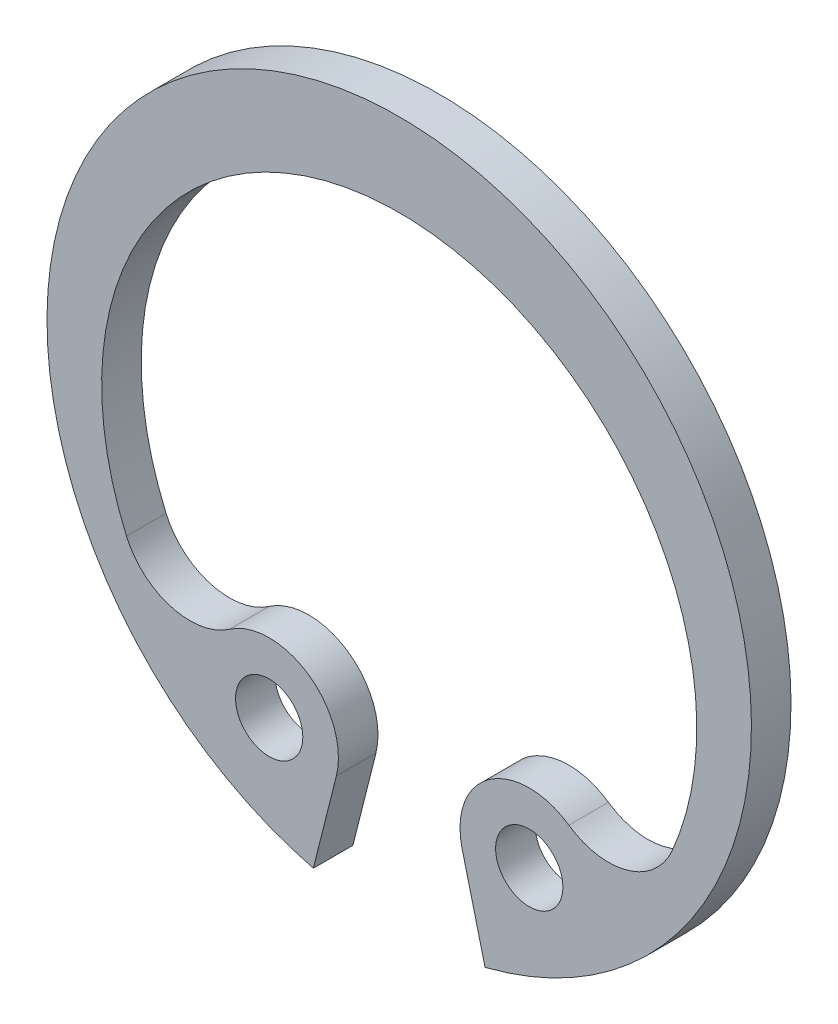
ISO-10303-21;
HEADER;
FILE_DESCRIPTION(('STEP AP214'),'2;1');
FILE_NAME('part.step','',(''),(''),'','','');
FILE_SCHEMA(('AUTOMOTIVE_DESIGN { 1 0 10303 214 1 1 1 1 }'));
ENDSEC;
DATA;
#1=APPLICATION_CONTEXT('core data for automotive mechanical design processes');
#2=APPLICATION_PROTOCOL_DEFINITION('international standard','automotive_design',2000,#1);
#3=PRODUCT_CONTEXT('',#1,'mechanical');
#4=PRODUCT('Part','Part','',(#3));
#5=PRODUCT_RELATED_PRODUCT_CATEGORY('part','',(#4));
#6=PRODUCT_DEFINITION_FORMATION('','',#4);
#7=PRODUCT_DEFINITION_CONTEXT('part definition',#1,'design');
#8=PRODUCT_DEFINITION('design','',#6,#7);
#9=PRODUCT_DEFINITION_SHAPE('','',#8);
#10=(LENGTH_UNIT() NAMED_UNIT(*) SI_UNIT(.MILLI.,.METRE.));
#11=(NAMED_UNIT(*) PLANE_ANGLE_UNIT() SI_UNIT($,.RADIAN.));
#12=(NAMED_UNIT(*) SI_UNIT($,.STERADIAN.) SOLID_ANGLE_UNIT());
#13=UNCERTAINTY_MEASURE_WITH_UNIT(LENGTH_MEASURE(1.E-05),#10,'distance_accuracy_value','');
#14=(GEOMETRIC_REPRESENTATION_CONTEXT(3) GLOBAL_UNCERTAINTY_ASSIGNED_CONTEXT((#13)) GLOBAL_UNIT_ASSIGNED_CONTEXT((#10,
#11,#12)) REPRESENTATION_CONTEXT('',''));
#15=CARTESIAN_POINT('',(0.,0.,0.));
#16=DIRECTION('',(0.,0.,1.));
#17=DIRECTION('',(1.,0.,0.));
#18=AXIS2_PLACEMENT_3D('',#15,#16,#17);
#19=CARTESIAN_POINT('',(0.,0.,-1.));
#20=DIRECTION('',(0.,0.,1.));
#21=DIRECTION('',(1.,0.,0.));
#22=AXIS2_PLACEMENT_3D('',#19,#20,#21);
#23=CYLINDRICAL_SURFACE('',#22,8.9);
#24=CARTESIAN_POINT('',(0.,0.,0.));
#25=DIRECTION('',(0.,0.,1.));
#26=DIRECTION('',(1.,0.,0.));
#27=AXIS2_PLACEMENT_3D('',#24,#25,#26);
#28=CIRCLE('',#27,8.9);
#29=CARTESIAN_POINT('',(2.169189237484,-8.63160576323916,0.));
#30=VERTEX_POINT('',#29);
#31=CARTESIAN_POINT('',(-2.169189237484,-8.63160576323916,0.));
#32=VERTEX_POINT('',#31);
#33=EDGE_CURVE('E129',#30,#32,#28,.T.);
#34=ORIENTED_EDGE('',*,*,#33,.F.);
#35=DIRECTION('',(0.,0.,1.));
#36=VECTOR('',#35,1.);
#37=CARTESIAN_POINT('',(2.169189237484,-8.63160576323916,-1.));
#38=LINE('',#37,#36);
#39=CARTESIAN_POINT('',(2.169189237484,-8.63160576323916,-1.));
#40=VERTEX_POINT('',#39);
#41=EDGE_CURVE('E11',#40,#30,#38,.T.);
#42=ORIENTED_EDGE('',*,*,#41,.F.);
#43=CARTESIAN_POINT('',(0.,0.,-1.));
#44=DIRECTION('',(0.,0.,1.));
#45=DIRECTION('',(1.,0.,0.));
#46=AXIS2_PLACEMENT_3D('',#43,#44,#45);
#47=CIRCLE('',#46,8.9);
#48=CARTESIAN_POINT('',(-2.169189237484,-8.63160576323916,-1.));
#49=VERTEX_POINT('',#48);
#50=EDGE_CURVE('E150',#40,#49,#47,.T.);
#51=ORIENTED_EDGE('',*,*,#50,.T.);
#52=DIRECTION('',(0.,0.,1.));
#53=VECTOR('',#52,1.);
#54=CARTESIAN_POINT('',(-2.169189237484,-8.63160576323916,-1.));
#55=LINE('',#54,#53);
#56=EDGE_CURVE('E35',#49,#32,#55,.T.);
#57=ORIENTED_EDGE('',*,*,#56,.T.);
#58=EDGE_LOOP('',(#34,#42,#51,#57));
#59=FACE_BOUND('',#58,.T.);
#60=ADVANCED_FACE('F32',(#59),#23,.T.);
#61=CARTESIAN_POINT('',(2.169189237484,-8.63160576323916,-1.));
#62=DIRECTION('',(-0.969843344184176,-0.243729127807191,0.));
#63=DIRECTION('',(0.243729127807191,-0.969843344184176,0.));
#64=AXIS2_PLACEMENT_3D('',#61,#62,#63);
#65=PLANE('',#64);
#66=DIRECTION('',(0.243729127807191,-0.969843344184176,0.));
#67=VECTOR('',#66,1.);
#68=CARTESIAN_POINT('',(2.169189237484,-8.63160576323916,0.));
#69=LINE('',#68,#67);
#70=CARTESIAN_POINT('',(1.58891951621859,-6.32260506207526,0.));
#71=VERTEX_POINT('',#70);
#72=EDGE_CURVE('E148',#71,#30,#69,.T.);
#73=ORIENTED_EDGE('',*,*,#72,.F.);
#74=DIRECTION('',(0.,0.,1.));
#75=VECTOR('',#74,1.);
#76=CARTESIAN_POINT('',(1.58891951621859,-6.32260506207526,-1.));
#77=LINE('',#76,#75);
#78=CARTESIAN_POINT('',(1.58891951621859,-6.32260506207526,-1.));
#79=VERTEX_POINT('',#78);
#80=EDGE_CURVE('E41',#79,#71,#77,.T.);
#81=ORIENTED_EDGE('',*,*,#80,.F.);
#82=DIRECTION('',(0.243729127807191,-0.969843344184176,0.));
#83=VECTOR('',#82,1.);
#84=CARTESIAN_POINT('',(2.169189237484,-8.63160576323916,-1.));
#85=LINE('',#84,#83);
#86=EDGE_CURVE('E119',#79,#40,#85,.T.);
#87=ORIENTED_EDGE('',*,*,#86,.T.);
#88=ORIENTED_EDGE('',*,*,#41,.T.);
#89=EDGE_LOOP('',(#73,#81,#87,#88));
#90=FACE_BOUND('',#89,.T.);
#91=ADVANCED_FACE('F162',(#90),#65,.T.);
#92=CARTESIAN_POINT('',(3.28614536854089,-5.89607908841267,-1.));
#93=DIRECTION('',(0.,0.,1.));
#94=DIRECTION('',(1.,0.,0.));
#95=AXIS2_PLACEMENT_3D('',#92,#93,#94);
#96=CYLINDRICAL_SURFACE('',#95,1.75);
#97=CARTESIAN_POINT('',(3.28614536854089,-5.89607908841267,0.));
#98=DIRECTION('',(0.,0.,1.));
#99=DIRECTION('',(1.,0.,0.));
#100=AXIS2_PLACEMENT_3D('',#97,#98,#99);
#101=CIRCLE('',#100,1.75);
#102=CARTESIAN_POINT('',(4.28705383370952,-4.4605714275645,0.));
#103=VERTEX_POINT('',#102);
#104=EDGE_CURVE('E106',#103,#71,#101,.T.);
#105=ORIENTED_EDGE('',*,*,#104,.F.);
#106=DIRECTION('',(0.,0.,1.));
#107=VECTOR('',#106,1.);
#108=CARTESIAN_POINT('',(4.28705383370952,-4.4605714275645,-1.));
#109=LINE('',#108,#107);
#110=CARTESIAN_POINT('',(4.28705383370952,-4.4605714275645,-1.));
#111=VERTEX_POINT('',#110);
#112=EDGE_CURVE('E101',#111,#103,#109,.T.);
#113=ORIENTED_EDGE('',*,*,#112,.F.);
#114=CARTESIAN_POINT('',(3.28614536854089,-5.89607908841267,-1.));
#115=DIRECTION('',(0.,0.,1.));
#116=DIRECTION('',(1.,0.,0.));
#117=AXIS2_PLACEMENT_3D('',#114,#115,#116);
#118=CIRCLE('',#117,1.75);
#119=EDGE_CURVE('E104',#111,#79,#118,.T.);
#120=ORIENTED_EDGE('',*,*,#119,.T.);
#121=ORIENTED_EDGE('',*,*,#80,.T.);
#122=EDGE_LOOP('',(#105,#113,#120,#121));
#123=FACE_BOUND('',#122,.T.);
#124=ADVANCED_FACE('F103',(#123),#96,.T.);
#125=CARTESIAN_POINT('',(5.28796229887815,-3.02506376671634,-1.));
#126=DIRECTION('',(0.,0.,1.));
#127=DIRECTION('',(1.,0.,0.));
#128=AXIS2_PLACEMENT_3D('',#125,#126,#127);
#129=CYLINDRICAL_SURFACE('',#128,1.75);
#130=CARTESIAN_POINT('',(5.28796229887815,-3.02506376671634,0.));
#131=DIRECTION('',(0.,0.,-1.));
#132=DIRECTION('',(1.,0.,0.));
#133=AXIS2_PLACEMENT_3D('',#130,#131,#132);
#134=CIRCLE('',#133,1.75);
#135=CARTESIAN_POINT('',(6.89205694045642,-3.7246210416123,0.));
#136=VERTEX_POINT('',#135);
#137=EDGE_CURVE('E145',#136,#103,#134,.T.);
#138=ORIENTED_EDGE('',*,*,#137,.F.);
#139=DIRECTION('',(0.,0.,1.));
#140=VECTOR('',#139,1.);
#141=CARTESIAN_POINT('',(6.89205694045642,-3.7246210416123,-1.));
#142=LINE('',#141,#140);
#143=CARTESIAN_POINT('',(6.89205694045642,-3.7246210416123,-1.));
#144=VERTEX_POINT('',#143);
#145=EDGE_CURVE('E111',#144,#136,#142,.T.);
#146=ORIENTED_EDGE('',*,*,#145,.F.);
#147=CARTESIAN_POINT('',(5.28796229887815,-3.02506376671634,-1.));
#148=DIRECTION('',(0.,0.,-1.));
#149=DIRECTION('',(1.,0.,0.));
#150=AXIS2_PLACEMENT_3D('',#147,#148,#149);
#151=CIRCLE('',#150,1.75);
#152=EDGE_CURVE('E117',#144,#111,#151,.T.);
#153=ORIENTED_EDGE('',*,*,#152,.T.);
#154=ORIENTED_EDGE('',*,*,#112,.T.);
#155=EDGE_LOOP('',(#138,#146,#153,#154));
#156=FACE_BOUND('',#155,.T.);
#157=ADVANCED_FACE('F121',(#156),#129,.F.);
#158=CARTESIAN_POINT('',(0.,-0.718945162694255,-1.));
#159=DIRECTION('',(0.,0.,1.));
#160=DIRECTION('',(1.,0.,0.));
#161=AXIS2_PLACEMENT_3D('',#158,#159,#160);
#162=CYLINDRICAL_SURFACE('',#161,7.51894516269425);
#163=CARTESIAN_POINT('',(0.,-0.718945162694255,0.));
#164=DIRECTION('',(0.,0.,-1.));
#165=DIRECTION('',(1.,0.,0.));
#166=AXIS2_PLACEMENT_3D('',#163,#164,#165);
#167=CIRCLE('',#166,7.51894516269425);
#168=CARTESIAN_POINT('',(-6.89205694045642,-3.7246210416123,0.));
#169=VERTEX_POINT('',#168);
#170=EDGE_CURVE('E142',#169,#136,#167,.T.);
#171=ORIENTED_EDGE('',*,*,#170,.F.);
#172=DIRECTION('',(0.,0.,1.));
#173=VECTOR('',#172,1.);
#174=CARTESIAN_POINT('',(-6.89205694045642,-3.7246210416123,-1.));
#175=LINE('',#174,#173);
#176=CARTESIAN_POINT('',(-6.89205694045642,-3.7246210416123,-1.));
#177=VERTEX_POINT('',#176);
#178=EDGE_CURVE('E154',#177,#169,#175,.T.);
#179=ORIENTED_EDGE('',*,*,#178,.F.);
#180=CARTESIAN_POINT('',(0.,-0.718945162694255,-1.));
#181=DIRECTION('',(0.,0.,-1.));
#182=DIRECTION('',(1.,0.,0.));
#183=AXIS2_PLACEMENT_3D('',#180,#181,#182);
#184=CIRCLE('',#183,7.51894516269425);
#185=EDGE_CURVE('E122',#177,#144,#184,.T.);
#186=ORIENTED_EDGE('',*,*,#185,.T.);
#187=ORIENTED_EDGE('',*,*,#145,.T.);
#188=EDGE_LOOP('',(#171,#179,#186,#187));
#189=FACE_BOUND('',#188,.T.);
#190=ADVANCED_FACE('F175',(#189),#162,.F.);
#191=CARTESIAN_POINT('',(-5.28796229887815,-3.02506376671634,-1.));
#192=DIRECTION('',(0.,0.,1.));
#193=DIRECTION('',(1.,0.,0.));
#194=AXIS2_PLACEMENT_3D('',#191,#192,#193);
#195=CYLINDRICAL_SURFACE('',#194,1.75);
#196=CARTESIAN_POINT('',(-5.28796229887815,-3.02506376671634,0.));
#197=DIRECTION('',(0.,0.,-1.));
#198=DIRECTION('',(1.,0.,0.));
#199=AXIS2_PLACEMENT_3D('',#196,#197,#198);
#200=CIRCLE('',#199,1.75);
#201=CARTESIAN_POINT('',(-4.28705383370952,-4.4605714275645,0.));
#202=VERTEX_POINT('',#201);
#203=EDGE_CURVE('E139',#202,#169,#200,.T.);
#204=ORIENTED_EDGE('',*,*,#203,.F.);
#205=DIRECTION('',(0.,0.,1.));
#206=VECTOR('',#205,1.);
#207=CARTESIAN_POINT('',(-4.28705383370952,-4.4605714275645,-1.));
#208=LINE('',#207,#206);
#209=CARTESIAN_POINT('',(-4.28705383370952,-4.4605714275645,-1.));
#210=VERTEX_POINT('',#209);
#211=EDGE_CURVE('E156',#210,#202,#208,.T.);
#212=ORIENTED_EDGE('',*,*,#211,.F.);
#213=CARTESIAN_POINT('',(-5.28796229887815,-3.02506376671634,-1.));
#214=DIRECTION('',(0.,0.,-1.));
#215=DIRECTION('',(1.,0.,0.));
#216=AXIS2_PLACEMENT_3D('',#213,#214,#215);
#217=CIRCLE('',#216,1.75);
#218=EDGE_CURVE('E124',#210,#177,#217,.T.);
#219=ORIENTED_EDGE('',*,*,#218,.T.);
#220=ORIENTED_EDGE('',*,*,#178,.T.);
#221=EDGE_LOOP('',(#204,#212,#219,#220));
#222=FACE_BOUND('',#221,.T.);
#223=ADVANCED_FACE('F178',(#222),#195,.F.);
#224=CARTESIAN_POINT('',(-3.28614536854089,-5.89607908841267,-1.));
#225=DIRECTION('',(0.,0.,1.));
#226=DIRECTION('',(1.,0.,0.));
#227=AXIS2_PLACEMENT_3D('',#224,#225,#226);
#228=CYLINDRICAL_SURFACE('',#227,1.75);
#229=CARTESIAN_POINT('',(-3.28614536854089,-5.89607908841267,0.));
#230=DIRECTION('',(0.,0.,1.));
#231=DIRECTION('',(1.,0.,0.));
#232=AXIS2_PLACEMENT_3D('',#229,#230,#231);
#233=CIRCLE('',#232,1.75);
#234=CARTESIAN_POINT('',(-1.58891951621859,-6.32260506207526,0.));
#235=VERTEX_POINT('',#234);
#236=EDGE_CURVE('E136',#235,#202,#233,.T.);
#237=ORIENTED_EDGE('',*,*,#236,.F.);
#238=DIRECTION('',(0.,0.,1.));
#239=VECTOR('',#238,1.);
#240=CARTESIAN_POINT('',(-1.58891951621859,-6.32260506207526,-1.));
#241=LINE('',#240,#239);
#242=CARTESIAN_POINT('',(-1.58891951621859,-6.32260506207526,-1.));
#243=VERTEX_POINT('',#242);
#244=EDGE_CURVE('E157',#243,#235,#241,.T.);
#245=ORIENTED_EDGE('',*,*,#244,.F.);
#246=CARTESIAN_POINT('',(-3.28614536854089,-5.89607908841267,-1.));
#247=DIRECTION('',(0.,0.,1.));
#248=DIRECTION('',(1.,0.,0.));
#249=AXIS2_PLACEMENT_3D('',#246,#247,#248);
#250=CIRCLE('',#249,1.75);
#251=EDGE_CURVE('E224',#243,#210,#250,.T.);
#252=ORIENTED_EDGE('',*,*,#251,.T.);
#253=ORIENTED_EDGE('',*,*,#211,.T.);
#254=EDGE_LOOP('',(#237,#245,#252,#253));
#255=FACE_BOUND('',#254,.T.);
#256=ADVANCED_FACE('F182',(#255),#228,.T.);
#257=CARTESIAN_POINT('',(-2.169189237484,-8.63160576323916,-1.));
#258=DIRECTION('',(0.969843344184176,-0.243729127807191,0.));
#259=DIRECTION('',(0.243729127807191,0.969843344184176,0.));
#260=AXIS2_PLACEMENT_3D('',#257,#258,#259);
#261=PLANE('',#260);
#262=DIRECTION('',(0.243729127807191,0.969843344184176,0.));
#263=VECTOR('',#262,1.);
#264=CARTESIAN_POINT('',(-2.169189237484,-8.63160576323916,0.));
#265=LINE('',#264,#263);
#266=EDGE_CURVE('E132',#32,#235,#265,.T.);
#267=ORIENTED_EDGE('',*,*,#266,.F.);
#268=ORIENTED_EDGE('',*,*,#56,.F.);
#269=DIRECTION('',(0.243729127807191,0.969843344184176,0.));
#270=VECTOR('',#269,1.);
#271=CARTESIAN_POINT('',(-2.169189237484,-8.63160576323916,-1.));
#272=LINE('',#271,#270);
#273=EDGE_CURVE('E222',#49,#243,#272,.T.);
#274=ORIENTED_EDGE('',*,*,#273,.T.);
#275=ORIENTED_EDGE('',*,*,#244,.T.);
#276=EDGE_LOOP('',(#267,#268,#274,#275));
#277=FACE_BOUND('',#276,.T.);
#278=ADVANCED_FACE('F159',(#277),#261,.T.);
#279=CARTESIAN_POINT('',(0.,0.,-1.));
#280=DIRECTION('',(0.,0.,1.));
#281=DIRECTION('',(1.,0.,0.));
#282=AXIS2_PLACEMENT_3D('',#279,#280,#281);
#283=PLANE('',#282);
#284=CARTESIAN_POINT('',(-3.2861453685409,-5.89607908841267,-1.));
#285=DIRECTION('',(0.,0.,1.));
#286=DIRECTION('',(1.,0.,0.));
#287=AXIS2_PLACEMENT_3D('',#284,#285,#286);
#288=CIRCLE('',#287,0.85);
#289=CARTESIAN_POINT('',(-2.4361453685409,-5.89607908841267,-1.));
#290=VERTEX_POINT('',#289);
#291=EDGE_CURVE('E209',#290,#290,#288,.T.);
#292=ORIENTED_EDGE('',*,*,#291,.T.);
#293=EDGE_LOOP('',(#292));
#294=FACE_BOUND('',#293,.T.);
#295=CARTESIAN_POINT('',(3.28614536854089,-5.89607908841267,-1.));
#296=DIRECTION('',(0.,0.,1.));
#297=DIRECTION('',(1.,0.,0.));
#298=AXIS2_PLACEMENT_3D('',#295,#296,#297);
#299=CIRCLE('',#298,0.85);
#300=CARTESIAN_POINT('',(4.13614536854089,-5.89607908841267,-1.));
#301=VERTEX_POINT('',#300);
#302=EDGE_CURVE('E133',#301,#301,#299,.T.);
#303=ORIENTED_EDGE('',*,*,#302,.T.);
#304=EDGE_LOOP('',(#303));
#305=FACE_BOUND('',#304,.T.);
#306=ORIENTED_EDGE('',*,*,#50,.F.);
#307=ORIENTED_EDGE('',*,*,#86,.F.);
#308=ORIENTED_EDGE('',*,*,#119,.F.);
#309=ORIENTED_EDGE('',*,*,#152,.F.);
#310=ORIENTED_EDGE('',*,*,#185,.F.);
#311=ORIENTED_EDGE('',*,*,#218,.F.);
#312=ORIENTED_EDGE('',*,*,#251,.F.);
#313=ORIENTED_EDGE('',*,*,#273,.F.);
#314=EDGE_LOOP('',(#306,#307,#308,#309,#310,#311,#312,#313));
#315=FACE_BOUND('',#314,.T.);
#316=ADVANCED_FACE('F115',(#294,#305,#315),#283,.F.);
#317=CARTESIAN_POINT('',(0.,0.,0.));
#318=DIRECTION('',(0.,0.,1.));
#319=DIRECTION('',(1.,0.,0.));
#320=AXIS2_PLACEMENT_3D('',#317,#318,#319);
#321=PLANE('',#320);
#322=CARTESIAN_POINT('',(-3.2861453685409,-5.89607908841267,0.));
#323=DIRECTION('',(0.,0.,1.));
#324=DIRECTION('',(1.,0.,0.));
#325=AXIS2_PLACEMENT_3D('',#322,#323,#324);
#326=CIRCLE('',#325,0.85);
#327=CARTESIAN_POINT('',(-2.4361453685409,-5.89607908841267,0.));
#328=VERTEX_POINT('',#327);
#329=EDGE_CURVE('E212',#328,#328,#326,.T.);
#330=ORIENTED_EDGE('',*,*,#329,.F.);
#331=EDGE_LOOP('',(#330));
#332=FACE_BOUND('',#331,.T.);
#333=CARTESIAN_POINT('',(3.28614536854089,-5.89607908841267,0.));
#334=DIRECTION('',(0.,0.,1.));
#335=DIRECTION('',(1.,0.,0.));
#336=AXIS2_PLACEMENT_3D('',#333,#334,#335);
#337=CIRCLE('',#336,0.85);
#338=CARTESIAN_POINT('',(4.13614536854089,-5.89607908841267,0.));
#339=VERTEX_POINT('',#338);
#340=EDGE_CURVE('E214',#339,#339,#337,.T.);
#341=ORIENTED_EDGE('',*,*,#340,.F.);
#342=EDGE_LOOP('',(#341));
#343=FACE_BOUND('',#342,.T.);
#344=ORIENTED_EDGE('',*,*,#33,.T.);
#345=ORIENTED_EDGE('',*,*,#266,.T.);
#346=ORIENTED_EDGE('',*,*,#236,.T.);
#347=ORIENTED_EDGE('',*,*,#203,.T.);
#348=ORIENTED_EDGE('',*,*,#170,.T.);
#349=ORIENTED_EDGE('',*,*,#137,.T.);
#350=ORIENTED_EDGE('',*,*,#104,.T.);
#351=ORIENTED_EDGE('',*,*,#72,.T.);
#352=EDGE_LOOP('',(#344,#345,#346,#347,#348,#349,#350,#351));
#353=FACE_BOUND('',#352,.T.);
#354=ADVANCED_FACE('F161',(#332,#343,#353),#321,.T.);
#355=CARTESIAN_POINT('',(3.28614536854089,-5.89607908841267,-1.));
#356=DIRECTION('',(0.,0.,1.));
#357=DIRECTION('',(1.,0.,0.));
#358=AXIS2_PLACEMENT_3D('',#355,#356,#357);
#359=CYLINDRICAL_SURFACE('',#358,0.85);
#360=ORIENTED_EDGE('',*,*,#302,.F.);
#361=EDGE_LOOP('',(#360));
#362=FACE_BOUND('',#361,.T.);
#363=ORIENTED_EDGE('',*,*,#340,.T.);
#364=EDGE_LOOP('',(#363));
#365=FACE_BOUND('',#364,.T.);
#366=ADVANCED_FACE('F194',(#362,#365),#359,.F.);
#367=CARTESIAN_POINT('',(-3.2861453685409,-5.89607908841267,-1.));
#368=DIRECTION('',(0.,0.,1.));
#369=DIRECTION('',(1.,0.,0.));
#370=AXIS2_PLACEMENT_3D('',#367,#368,#369);
#371=CYLINDRICAL_SURFACE('',#370,0.85);
#372=ORIENTED_EDGE('',*,*,#291,.F.);
#373=EDGE_LOOP('',(#372));
#374=FACE_BOUND('',#373,.T.);
#375=ORIENTED_EDGE('',*,*,#329,.T.);
#376=EDGE_LOOP('',(#375));
#377=FACE_BOUND('',#376,.T.);
#378=ADVANCED_FACE('F201',(#374,#377),#371,.F.);
#379=CLOSED_SHELL('',(#60,#91,#124,#157,#190,#223,#256,#278,#316,#354,#366,#378));
#380=MANIFOLD_SOLID_BREP('B2',#379);
#381=ADVANCED_BREP_SHAPE_REPRESENTATION('',(#18,#380),#14);
#382=SHAPE_DEFINITION_REPRESENTATION(#9,#381);
ENDSEC;
END-ISO-10303-21;
